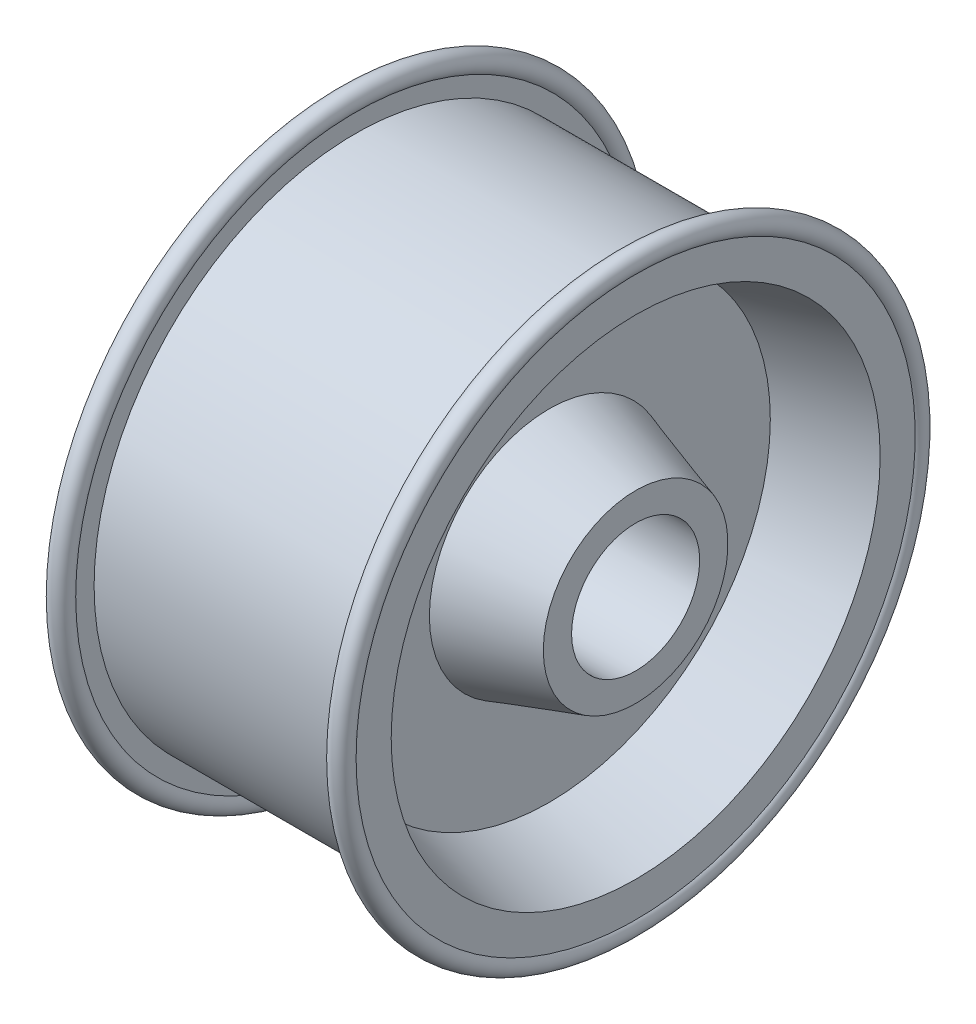
ISO-10303-21;
HEADER;
FILE_DESCRIPTION(('STEP AP214'),'2;1');
FILE_NAME('part.step','',(''),(''),'','','');
FILE_SCHEMA(('AUTOMOTIVE_DESIGN { 1 0 10303 214 1 1 1 1 }'));
ENDSEC;
DATA;
#1=APPLICATION_CONTEXT('core data for automotive mechanical design processes');
#2=APPLICATION_PROTOCOL_DEFINITION('international standard','automotive_design',2000,#1);
#3=PRODUCT_CONTEXT('',#1,'mechanical');
#4=PRODUCT('Part','Part','',(#3));
#5=PRODUCT_RELATED_PRODUCT_CATEGORY('part','',(#4));
#6=PRODUCT_DEFINITION_FORMATION('','',#4);
#7=PRODUCT_DEFINITION_CONTEXT('part definition',#1,'design');
#8=PRODUCT_DEFINITION('design','',#6,#7);
#9=PRODUCT_DEFINITION_SHAPE('','',#8);
#10=(LENGTH_UNIT() NAMED_UNIT(*) SI_UNIT(.MILLI.,.METRE.));
#11=(NAMED_UNIT(*) PLANE_ANGLE_UNIT() SI_UNIT($,.RADIAN.));
#12=(NAMED_UNIT(*) SI_UNIT($,.STERADIAN.) SOLID_ANGLE_UNIT());
#13=UNCERTAINTY_MEASURE_WITH_UNIT(LENGTH_MEASURE(1.E-05),#10,'distance_accuracy_value','');
#14=(GEOMETRIC_REPRESENTATION_CONTEXT(3) GLOBAL_UNCERTAINTY_ASSIGNED_CONTEXT((#13)) GLOBAL_UNIT_ASSIGNED_CONTEXT((#10,
#11,#12)) REPRESENTATION_CONTEXT('',''));
#15=CARTESIAN_POINT('',(0.,0.,0.));
#16=DIRECTION('',(0.,0.,1.));
#17=DIRECTION('',(1.,0.,0.));
#18=AXIS2_PLACEMENT_3D('',#15,#16,#17);
#19=CARTESIAN_POINT('',(34.3064040615982,0.,0.));
#20=DIRECTION('',(1.,0.,0.));
#21=DIRECTION('',(0.,0.,-1.));
#22=AXIS2_PLACEMENT_3D('',#19,#20,#21);
#23=PLANE('',#22);
#24=CARTESIAN_POINT('',(34.3064040615982,0.,0.));
#25=DIRECTION('',(-1.,0.,0.));
#26=DIRECTION('',(0.,0.,1.));
#27=AXIS2_PLACEMENT_3D('',#24,#25,#26);
#28=CIRCLE('',#27,67.4603309005536);
#29=CARTESIAN_POINT('',(34.3064040615982,0.,67.4603309005536));
#30=VERTEX_POINT('',#29);
#31=EDGE_CURVE('E89',#30,#30,#28,.T.);
#32=ORIENTED_EDGE('',*,*,#31,.F.);
#33=EDGE_LOOP('',(#32));
#34=FACE_BOUND('',#33,.T.);
#35=CARTESIAN_POINT('',(34.3064040615982,0.,0.));
#36=DIRECTION('',(-1.,0.,0.));
#37=DIRECTION('',(0.,0.,1.));
#38=AXIS2_PLACEMENT_3D('',#35,#36,#37);
#39=CIRCLE('',#38,72.20748502994);
#40=CARTESIAN_POINT('',(34.3064040615982,0.,72.20748502994));
#41=VERTEX_POINT('',#40);
#42=EDGE_CURVE('E86',#41,#41,#39,.T.);
#43=ORIENTED_EDGE('',*,*,#42,.T.);
#44=EDGE_LOOP('',(#43));
#45=FACE_BOUND('',#44,.T.);
#46=ADVANCED_FACE('F39',(#34,#45),#23,.F.);
#47=CARTESIAN_POINT('',(-841.873116512072,0.,0.));
#48=DIRECTION('',(-1.,0.,0.));
#49=DIRECTION('',(0.,0.,1.));
#50=AXIS2_PLACEMENT_3D('',#47,#48,#49);
#51=CYLINDRICAL_SURFACE('',#50,67.4603309005535);
#52=CARTESIAN_POINT('',(-34.3064040615987,0.,0.));
#53=DIRECTION('',(-1.,0.,0.));
#54=DIRECTION('',(0.,0.,1.));
#55=AXIS2_PLACEMENT_3D('',#52,#53,#54);
#56=CIRCLE('',#55,67.4603309005534);
#57=CARTESIAN_POINT('',(-34.3064040615987,0.,67.4603309005534));
#58=VERTEX_POINT('',#57);
#59=EDGE_CURVE('E92',#58,#58,#56,.T.);
#60=ORIENTED_EDGE('',*,*,#59,.F.);
#61=EDGE_LOOP('',(#60));
#62=FACE_BOUND('',#61,.T.);
#63=ORIENTED_EDGE('',*,*,#31,.T.);
#64=EDGE_LOOP('',(#63));
#65=FACE_BOUND('',#64,.T.);
#66=ADVANCED_FACE('F142',(#62,#65),#51,.T.);
#67=CARTESIAN_POINT('',(-34.3064040615987,-2.50727584906509E-13,0.));
#68=DIRECTION('',(1.,0.,0.));
#69=DIRECTION('',(0.,0.,-1.));
#70=AXIS2_PLACEMENT_3D('',#67,#68,#69);
#71=PLANE('',#70);
#72=ORIENTED_EDGE('',*,*,#59,.T.);
#73=EDGE_LOOP('',(#72));
#74=FACE_BOUND('',#73,.T.);
#75=CARTESIAN_POINT('',(-34.3064040615987,0.,0.));
#76=DIRECTION('',(-1.,0.,0.));
#77=DIRECTION('',(0.,0.,1.));
#78=AXIS2_PLACEMENT_3D('',#75,#76,#77);
#79=CIRCLE('',#78,72.2074850299398);
#80=CARTESIAN_POINT('',(-34.3064040615987,0.,72.2074850299398));
#81=VERTEX_POINT('',#80);
#82=EDGE_CURVE('E10',#81,#81,#79,.T.);
#83=ORIENTED_EDGE('',*,*,#82,.F.);
#84=EDGE_LOOP('',(#83));
#85=FACE_BOUND('',#84,.T.);
#86=ADVANCED_FACE('F41',(#74,#85),#71,.T.);
#87=CARTESIAN_POINT('',(36.2102183592649,0.,0.));
#88=DIRECTION('',(-1.,0.,0.));
#89=DIRECTION('',(0.,0.,1.));
#90=AXIS2_PLACEMENT_3D('',#87,#88,#89);
#91=TOROIDAL_SURFACE('',#90,74.1112993276067,2.69240000000001);
#92=CARTESIAN_POINT('',(38.1140326569316,0.,0.));
#93=DIRECTION('',(-1.,0.,0.));
#94=DIRECTION('',(0.,0.,1.));
#95=AXIS2_PLACEMENT_3D('',#92,#93,#94);
#96=CIRCLE('',#95,72.20748502994);
#97=CARTESIAN_POINT('',(38.1140326569316,0.,72.20748502994));
#98=VERTEX_POINT('',#97);
#99=EDGE_CURVE('E83',#98,#98,#96,.T.);
#100=ORIENTED_EDGE('',*,*,#99,.T.);
#101=EDGE_LOOP('',(#100));
#102=FACE_BOUND('',#101,.T.);
#103=ORIENTED_EDGE('',*,*,#42,.F.);
#104=EDGE_LOOP('',(#103));
#105=FACE_BOUND('',#104,.T.);
#106=ADVANCED_FACE('F150',(#102,#105),#91,.T.);
#107=CARTESIAN_POINT('',(38.1140326569316,0.,0.));
#108=DIRECTION('',(-1.,0.,0.));
#109=DIRECTION('',(0.,0.,1.));
#110=AXIS2_PLACEMENT_3D('',#107,#108,#109);
#111=PLANE('',#110);
#112=ORIENTED_EDGE('',*,*,#99,.F.);
#113=EDGE_LOOP('',(#112));
#114=FACE_BOUND('',#113,.T.);
#115=CARTESIAN_POINT('',(38.1140326569316,0.,0.));
#116=DIRECTION('',(-1.,0.,0.));
#117=DIRECTION('',(0.,0.,1.));
#118=AXIS2_PLACEMENT_3D('',#115,#116,#117);
#119=CIRCLE('',#118,63.1445905462738);
#120=CARTESIAN_POINT('',(38.1140326569316,0.,63.1445905462738));
#121=VERTEX_POINT('',#120);
#122=EDGE_CURVE('E80',#121,#121,#119,.T.);
#123=ORIENTED_EDGE('',*,*,#122,.T.);
#124=EDGE_LOOP('',(#123));
#125=FACE_BOUND('',#124,.T.);
#126=ADVANCED_FACE('F160',(#114,#125),#111,.F.);
#127=CARTESIAN_POINT('',(15.7419161676646,0.,0.));
#128=DIRECTION('',(1.,0.,0.));
#129=DIRECTION('',(0.,0.,-1.));
#130=AXIS2_PLACEMENT_3D('',#127,#128,#129);
#131=CONICAL_SURFACE('',#130,57.1499999999999,0.261799387799143);
#132=ORIENTED_EDGE('',*,*,#122,.F.);
#133=EDGE_LOOP('',(#132));
#134=FACE_BOUND('',#133,.T.);
#135=CARTESIAN_POINT('',(15.7419161676646,0.,0.));
#136=DIRECTION('',(-1.,0.,0.));
#137=DIRECTION('',(0.,0.,1.));
#138=AXIS2_PLACEMENT_3D('',#135,#136,#137);
#139=CIRCLE('',#138,57.1499999999999);
#140=CARTESIAN_POINT('',(15.7419161676646,0.,57.1499999999999));
#141=VERTEX_POINT('',#140);
#142=EDGE_CURVE('E77',#141,#141,#139,.T.);
#143=ORIENTED_EDGE('',*,*,#142,.T.);
#144=EDGE_LOOP('',(#143));
#145=FACE_BOUND('',#144,.T.);
#146=ADVANCED_FACE('F108',(#134,#145),#131,.F.);
#147=CARTESIAN_POINT('',(15.7419161676646,0.,0.));
#148=DIRECTION('',(-1.,0.,0.));
#149=DIRECTION('',(0.,0.,1.));
#150=AXIS2_PLACEMENT_3D('',#147,#148,#149);
#151=PLANE('',#150);
#152=CARTESIAN_POINT('',(15.7419161676646,44.45,0.));
#153=DIRECTION('',(1.,0.,0.));
#154=DIRECTION('',(0.,0.,-1.));
#155=AXIS2_PLACEMENT_3D('',#152,#153,#154);
#156=CIRCLE('',#155,3.80999999999999);
#157=CARTESIAN_POINT('',(15.7419161676646,44.45,-3.80999999999999));
#158=VERTEX_POINT('',#157);
#159=EDGE_CURVE('E98',#158,#158,#156,.T.);
#160=ORIENTED_EDGE('',*,*,#159,.F.);
#161=EDGE_LOOP('',(#160));
#162=FACE_BOUND('',#161,.T.);
#163=ORIENTED_EDGE('',*,*,#142,.F.);
#164=EDGE_LOOP('',(#163));
#165=FACE_BOUND('',#164,.T.);
#166=CARTESIAN_POINT('',(15.7419161676646,0.,0.));
#167=DIRECTION('',(-1.,0.,0.));
#168=DIRECTION('',(0.,0.,1.));
#169=AXIS2_PLACEMENT_3D('',#166,#167,#168);
#170=CIRCLE('',#169,30.9134730538922);
#171=CARTESIAN_POINT('',(15.7419161676646,0.,30.9134730538922));
#172=VERTEX_POINT('',#171);
#173=EDGE_CURVE('E74',#172,#172,#170,.T.);
#174=ORIENTED_EDGE('',*,*,#173,.T.);
#175=EDGE_LOOP('',(#174));
#176=FACE_BOUND('',#175,.T.);
#177=ADVANCED_FACE('F104',(#162,#165,#176),#151,.F.);
#178=CARTESIAN_POINT('',(38.0999999999999,0.,0.));
#179=DIRECTION('',(-1.,0.,0.));
#180=DIRECTION('',(0.,0.,1.));
#181=AXIS2_PLACEMENT_3D('',#178,#179,#180);
#182=CONICAL_SURFACE('',#181,23.8410179640718,0.306367152616047);
#183=ORIENTED_EDGE('',*,*,#173,.F.);
#184=EDGE_LOOP('',(#183));
#185=FACE_BOUND('',#184,.T.);
#186=CARTESIAN_POINT('',(38.0999999999999,0.,0.));
#187=DIRECTION('',(-1.,0.,0.));
#188=DIRECTION('',(0.,0.,1.));
#189=AXIS2_PLACEMENT_3D('',#186,#187,#188);
#190=CIRCLE('',#189,23.8410179640718);
#191=CARTESIAN_POINT('',(38.0999999999999,0.,23.8410179640718));
#192=VERTEX_POINT('',#191);
#193=EDGE_CURVE('E71',#192,#192,#190,.T.);
#194=ORIENTED_EDGE('',*,*,#193,.T.);
#195=EDGE_LOOP('',(#194));
#196=FACE_BOUND('',#195,.T.);
#197=ADVANCED_FACE('F107',(#185,#196),#182,.T.);
#198=CARTESIAN_POINT('',(38.0999999999999,0.,0.));
#199=DIRECTION('',(-1.,0.,0.));
#200=DIRECTION('',(0.,0.,1.));
#201=AXIS2_PLACEMENT_3D('',#198,#199,#200);
#202=PLANE('',#201);
#203=ORIENTED_EDGE('',*,*,#193,.F.);
#204=EDGE_LOOP('',(#203));
#205=FACE_BOUND('',#204,.T.);
#206=CARTESIAN_POINT('',(38.0999999999999,0.,0.));
#207=DIRECTION('',(-1.,0.,0.));
#208=DIRECTION('',(0.,0.,1.));
#209=AXIS2_PLACEMENT_3D('',#206,#207,#208);
#210=CIRCLE('',#209,16.5404191616702);
#211=CARTESIAN_POINT('',(38.0999999999999,0.,16.5404191616702));
#212=VERTEX_POINT('',#211);
#213=EDGE_CURVE('E68',#212,#212,#210,.T.);
#214=ORIENTED_EDGE('',*,*,#213,.T.);
#215=EDGE_LOOP('',(#214));
#216=FACE_BOUND('',#215,.T.);
#217=ADVANCED_FACE('F116',(#205,#216),#202,.F.);
#218=CARTESIAN_POINT('',(-841.873116512072,0.,0.));
#219=DIRECTION('',(-1.,0.,0.));
#220=DIRECTION('',(0.,0.,1.));
#221=AXIS2_PLACEMENT_3D('',#218,#219,#220);
#222=CYLINDRICAL_SURFACE('',#221,16.5404191616701);
#223=ORIENTED_EDGE('',*,*,#213,.F.);
#224=EDGE_LOOP('',(#223));
#225=FACE_BOUND('',#224,.T.);
#226=CARTESIAN_POINT('',(-38.1,0.,0.));
#227=DIRECTION('',(-1.,0.,0.));
#228=DIRECTION('',(0.,0.,1.));
#229=AXIS2_PLACEMENT_3D('',#226,#227,#228);
#230=CIRCLE('',#229,16.54041916167);
#231=CARTESIAN_POINT('',(-38.1,0.,16.54041916167));
#232=VERTEX_POINT('',#231);
#233=EDGE_CURVE('E65',#232,#232,#230,.T.);
#234=ORIENTED_EDGE('',*,*,#233,.T.);
#235=EDGE_LOOP('',(#234));
#236=FACE_BOUND('',#235,.T.);
#237=ADVANCED_FACE('F122',(#225,#236),#222,.F.);
#238=CARTESIAN_POINT('',(-38.1000000000001,-2.89698820487871E-13,0.));
#239=DIRECTION('',(-1.,0.,0.));
#240=DIRECTION('',(0.,0.,1.));
#241=AXIS2_PLACEMENT_3D('',#238,#239,#240);
#242=PLANE('',#241);
#243=CARTESIAN_POINT('',(-38.1000000000001,0.,0.));
#244=DIRECTION('',(-1.,0.,0.));
#245=DIRECTION('',(0.,0.,1.));
#246=AXIS2_PLACEMENT_3D('',#243,#244,#245);
#247=CIRCLE('',#246,23.8410179640716);
#248=CARTESIAN_POINT('',(-38.1000000000001,0.,23.8410179640716));
#249=VERTEX_POINT('',#248);
#250=EDGE_CURVE('E62',#249,#249,#247,.T.);
#251=ORIENTED_EDGE('',*,*,#250,.T.);
#252=EDGE_LOOP('',(#251));
#253=FACE_BOUND('',#252,.T.);
#254=ORIENTED_EDGE('',*,*,#233,.F.);
#255=EDGE_LOOP('',(#254));
#256=FACE_BOUND('',#255,.T.);
#257=ADVANCED_FACE('F128',(#253,#256),#242,.T.);
#258=CARTESIAN_POINT('',(-38.1000000000001,0.,0.));
#259=DIRECTION('',(1.,0.,0.));
#260=DIRECTION('',(0.,0.,-1.));
#261=AXIS2_PLACEMENT_3D('',#258,#259,#260);
#262=CONICAL_SURFACE('',#261,23.8410179640716,0.306367152616056);
#263=CARTESIAN_POINT('',(-15.7419161676648,0.,0.));
#264=DIRECTION('',(-1.,0.,0.));
#265=DIRECTION('',(0.,0.,1.));
#266=AXIS2_PLACEMENT_3D('',#263,#264,#265);
#267=CIRCLE('',#266,30.9134730538922);
#268=CARTESIAN_POINT('',(-15.7419161676648,0.,30.9134730538922));
#269=VERTEX_POINT('',#268);
#270=EDGE_CURVE('E59',#269,#269,#267,.T.);
#271=ORIENTED_EDGE('',*,*,#270,.T.);
#272=EDGE_LOOP('',(#271));
#273=FACE_BOUND('',#272,.T.);
#274=ORIENTED_EDGE('',*,*,#250,.F.);
#275=EDGE_LOOP('',(#274));
#276=FACE_BOUND('',#275,.T.);
#277=ADVANCED_FACE('F133',(#273,#276),#262,.T.);
#278=CARTESIAN_POINT('',(-15.741916167665,-1.08246744900953E-13,0.));
#279=DIRECTION('',(-1.,0.,0.));
#280=DIRECTION('',(0.,0.,1.));
#281=AXIS2_PLACEMENT_3D('',#278,#279,#280);
#282=PLANE('',#281);
#283=CARTESIAN_POINT('',(-15.741916167665,44.45,0.));
#284=DIRECTION('',(-1.,0.,0.));
#285=DIRECTION('',(0.,0.,1.));
#286=AXIS2_PLACEMENT_3D('',#283,#284,#285);
#287=CIRCLE('',#286,3.80999999999999);
#288=CARTESIAN_POINT('',(-15.741916167665,44.45,3.80999999999999));
#289=VERTEX_POINT('',#288);
#290=EDGE_CURVE('E95',#289,#289,#287,.T.);
#291=ORIENTED_EDGE('',*,*,#290,.F.);
#292=EDGE_LOOP('',(#291));
#293=FACE_BOUND('',#292,.T.);
#294=CARTESIAN_POINT('',(-15.7419161676651,0.,0.));
#295=DIRECTION('',(-1.,0.,0.));
#296=DIRECTION('',(0.,0.,1.));
#297=AXIS2_PLACEMENT_3D('',#294,#295,#296);
#298=CIRCLE('',#297,57.1499999999999);
#299=CARTESIAN_POINT('',(-15.7419161676651,0.,57.1499999999999));
#300=VERTEX_POINT('',#299);
#301=EDGE_CURVE('E54',#300,#300,#298,.T.);
#302=ORIENTED_EDGE('',*,*,#301,.T.);
#303=EDGE_LOOP('',(#302));
#304=FACE_BOUND('',#303,.T.);
#305=ORIENTED_EDGE('',*,*,#270,.F.);
#306=EDGE_LOOP('',(#305));
#307=FACE_BOUND('',#306,.T.);
#308=ADVANCED_FACE('F139',(#293,#304,#307),#282,.T.);
#309=CARTESIAN_POINT('',(-15.7419161676651,0.,0.));
#310=DIRECTION('',(-1.,0.,0.));
#311=DIRECTION('',(0.,0.,1.));
#312=AXIS2_PLACEMENT_3D('',#309,#310,#311);
#313=CONICAL_SURFACE('',#312,57.1499999999999,0.261799387799133);
#314=CARTESIAN_POINT('',(-38.114032656932,0.,0.));
#315=DIRECTION('',(-1.,0.,0.));
#316=DIRECTION('',(0.,0.,1.));
#317=AXIS2_PLACEMENT_3D('',#314,#315,#316);
#318=CIRCLE('',#317,63.1445905462736);
#319=CARTESIAN_POINT('',(-38.114032656932,0.,63.1445905462736));
#320=VERTEX_POINT('',#319);
#321=EDGE_CURVE('E50',#320,#320,#318,.T.);
#322=ORIENTED_EDGE('',*,*,#321,.T.);
#323=EDGE_LOOP('',(#322));
#324=FACE_BOUND('',#323,.T.);
#325=ORIENTED_EDGE('',*,*,#301,.F.);
#326=EDGE_LOOP('',(#325));
#327=FACE_BOUND('',#326,.T.);
#328=ADVANCED_FACE('F219',(#324,#327),#313,.F.);
#329=CARTESIAN_POINT('',(-38.114032656932,-2.91815412099467E-13,0.));
#330=DIRECTION('',(-1.,0.,0.));
#331=DIRECTION('',(0.,0.,1.));
#332=AXIS2_PLACEMENT_3D('',#329,#330,#331);
#333=PLANE('',#332);
#334=CARTESIAN_POINT('',(-38.114032656932,0.,0.));
#335=DIRECTION('',(-1.,0.,0.));
#336=DIRECTION('',(0.,0.,1.));
#337=AXIS2_PLACEMENT_3D('',#334,#335,#336);
#338=CIRCLE('',#337,72.2074850299398);
#339=CARTESIAN_POINT('',(-38.114032656932,0.,72.2074850299398));
#340=VERTEX_POINT('',#339);
#341=EDGE_CURVE('E46',#340,#340,#338,.T.);
#342=ORIENTED_EDGE('',*,*,#341,.T.);
#343=EDGE_LOOP('',(#342));
#344=FACE_BOUND('',#343,.T.);
#345=ORIENTED_EDGE('',*,*,#321,.F.);
#346=EDGE_LOOP('',(#345));
#347=FACE_BOUND('',#346,.T.);
#348=ADVANCED_FACE('F232',(#344,#347),#333,.T.);
#349=CARTESIAN_POINT('',(-36.2102183592654,0.,0.));
#350=DIRECTION('',(-1.,0.,0.));
#351=DIRECTION('',(0.,0.,1.));
#352=AXIS2_PLACEMENT_3D('',#349,#350,#351);
#353=TOROIDAL_SURFACE('',#352,74.1112993276064,2.69240000000001);
#354=ORIENTED_EDGE('',*,*,#341,.F.);
#355=EDGE_LOOP('',(#354));
#356=FACE_BOUND('',#355,.T.);
#357=ORIENTED_EDGE('',*,*,#82,.T.);
#358=EDGE_LOOP('',(#357));
#359=FACE_BOUND('',#358,.T.);
#360=ADVANCED_FACE('F245',(#356,#359),#353,.T.);
#361=CARTESIAN_POINT('',(15.7419161676646,44.45,0.));
#362=DIRECTION('',(1.,0.,0.));
#363=DIRECTION('',(0.,0.,-1.));
#364=AXIS2_PLACEMENT_3D('',#361,#362,#363);
#365=CYLINDRICAL_SURFACE('',#364,3.80999999999999);
#366=ORIENTED_EDGE('',*,*,#290,.T.);
#367=EDGE_LOOP('',(#366));
#368=FACE_BOUND('',#367,.T.);
#369=ORIENTED_EDGE('',*,*,#159,.T.);
#370=EDGE_LOOP('',(#369));
#371=FACE_BOUND('',#370,.T.);
#372=ADVANCED_FACE('F102',(#368,#371),#365,.F.);
#373=CLOSED_SHELL('',(#46,#66,#86,#106,#126,#146,#177,#197,#217,#237,#257,#277,#308,#328,#348,
#360,#372));
#374=MANIFOLD_SOLID_BREP('B2',#373);
#375=ADVANCED_BREP_SHAPE_REPRESENTATION('',(#18,#374),#14);
#376=SHAPE_DEFINITION_REPRESENTATION(#9,#375);
ENDSEC;
END-ISO-10303-21;
